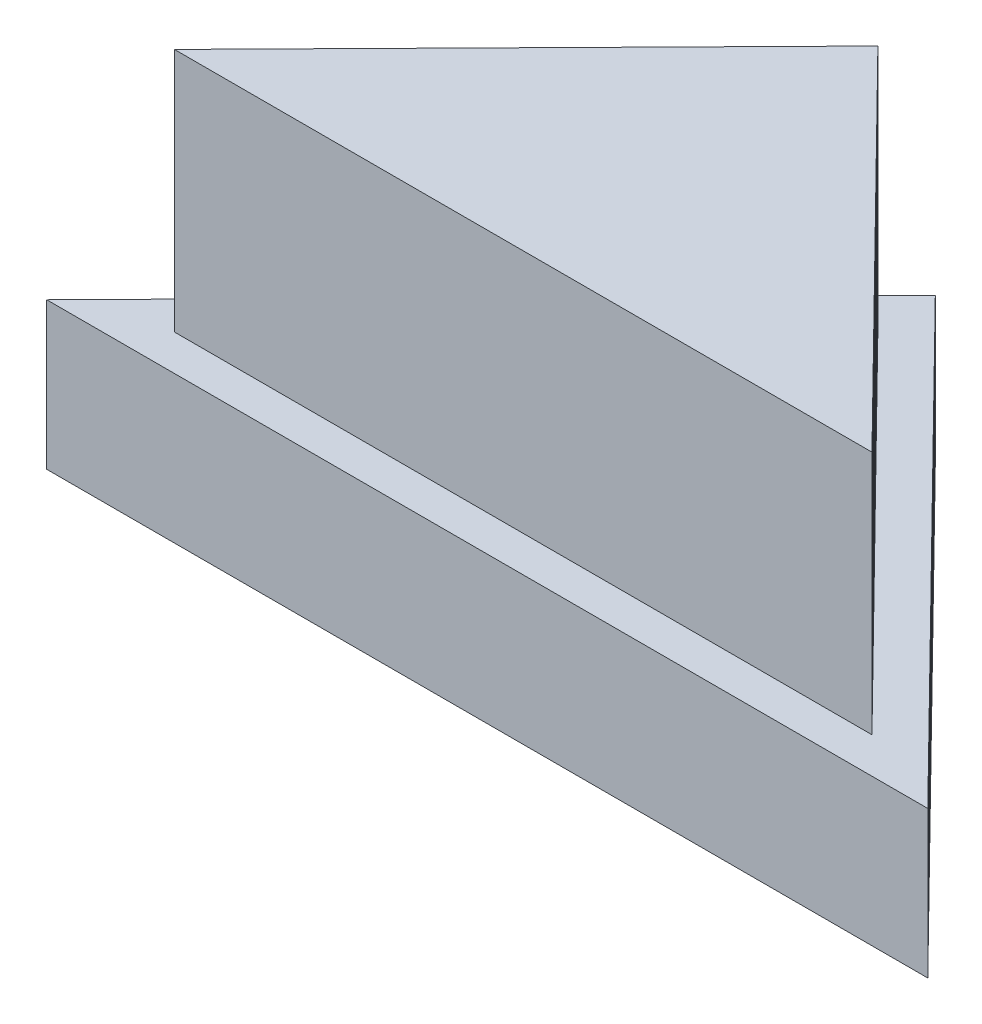
ISO-10303-21;
HEADER;
FILE_DESCRIPTION(('STEP AP214'),'2;1');
FILE_NAME('part.step','',(''),(''),'','','');
FILE_SCHEMA(('AUTOMOTIVE_DESIGN { 1 0 10303 214 1 1 1 1 }'));
ENDSEC;
DATA;
#1=APPLICATION_CONTEXT('core data for automotive mechanical design processes');
#2=APPLICATION_PROTOCOL_DEFINITION('international standard','automotive_design',2000,#1);
#3=PRODUCT_CONTEXT('',#1,'mechanical');
#4=PRODUCT('Part','Part','',(#3));
#5=PRODUCT_RELATED_PRODUCT_CATEGORY('part','',(#4));
#6=PRODUCT_DEFINITION_FORMATION('','',#4);
#7=PRODUCT_DEFINITION_CONTEXT('part definition',#1,'design');
#8=PRODUCT_DEFINITION('design','',#6,#7);
#9=PRODUCT_DEFINITION_SHAPE('','',#8);
#10=(LENGTH_UNIT() NAMED_UNIT(*) SI_UNIT(.MILLI.,.METRE.));
#11=(NAMED_UNIT(*) PLANE_ANGLE_UNIT() SI_UNIT($,.RADIAN.));
#12=(NAMED_UNIT(*) SI_UNIT($,.STERADIAN.) SOLID_ANGLE_UNIT());
#13=UNCERTAINTY_MEASURE_WITH_UNIT(LENGTH_MEASURE(1.E-05),#10,'distance_accuracy_value','');
#14=(GEOMETRIC_REPRESENTATION_CONTEXT(3) GLOBAL_UNCERTAINTY_ASSIGNED_CONTEXT((#13)) GLOBAL_UNIT_ASSIGNED_CONTEXT((#10,
#11,#12)) REPRESENTATION_CONTEXT('',''));
#15=CARTESIAN_POINT('',(0.,0.,0.));
#16=DIRECTION('',(0.,0.,1.));
#17=DIRECTION('',(1.,0.,0.));
#18=AXIS2_PLACEMENT_3D('',#15,#16,#17);
#19=CARTESIAN_POINT('',(0.,3.,0.));
#20=DIRECTION('',(0.,-1.,0.));
#21=DIRECTION('',(0.,0.,-1.));
#22=AXIS2_PLACEMENT_3D('',#19,#20,#21);
#23=PLANE('',#22);
#24=DIRECTION('',(-0.70110636736576,0.,0.713056702962105));
#25=VECTOR('',#24,1.);
#26=CARTESIAN_POINT('',(-0.0167470017223667,3.,-0.756293591484106));
#27=LINE('',#26,#25);
#28=CARTESIAN_POINT('',(-0.0167470017223667,3.,-0.756293591484106));
#29=VERTEX_POINT('',#28);
#30=CARTESIAN_POINT('',(-9.01674700172237,3.,8.39711112051589));
#31=VERTEX_POINT('',#30);
#32=EDGE_CURVE('E125',#29,#31,#27,.T.);
#33=ORIENTED_EDGE('',*,*,#32,.T.);
#34=DIRECTION('',(1.,0.,0.));
#35=VECTOR('',#34,1.);
#36=CARTESIAN_POINT('',(8.98325299827764,3.,8.39711112051589));
#37=LINE('',#36,#35);
#38=CARTESIAN_POINT('',(8.98325299827764,3.,8.39711112051589));
#39=VERTEX_POINT('',#38);
#40=EDGE_CURVE('E129',#31,#39,#37,.T.);
#41=ORIENTED_EDGE('',*,*,#40,.T.);
#42=DIRECTION('',(-0.70110636736576,0.,-0.713056702962105));
#43=VECTOR('',#42,1.);
#44=CARTESIAN_POINT('',(8.98325299827764,3.,8.39711112051589));
#45=LINE('',#44,#43);
#46=EDGE_CURVE('E133',#39,#29,#45,.T.);
#47=ORIENTED_EDGE('',*,*,#46,.T.);
#48=EDGE_LOOP('',(#33,#41,#47));
#49=FACE_BOUND('',#48,.T.);
#50=DIRECTION('',(-0.701111712421095,0.,0.713051447446788));
#51=VECTOR('',#50,1.);
#52=CARTESIAN_POINT('',(-7.1410848865332,3.,7.66338087653282));
#53=LINE('',#52,#51);
#54=CARTESIAN_POINT('',(-0.0159780494453974,3.,0.416935476477905));
#55=VERTEX_POINT('',#54);
#56=CARTESIAN_POINT('',(-7.1410848865332,3.,7.66338087653282));
#57=VERTEX_POINT('',#56);
#58=EDGE_CURVE('E55',#55,#57,#53,.T.);
#59=ORIENTED_EDGE('',*,*,#58,.F.);
#60=DIRECTION('',(-0.701106367215476,0.,-0.713056703109871));
#61=VECTOR('',#60,1.);
#62=CARTESIAN_POINT('',(7.10902195055455,3.,7.66338087653282));
#63=LINE('',#62,#61);
#64=CARTESIAN_POINT('',(7.10902195055455,3.,7.66338087653282));
#65=VERTEX_POINT('',#64);
#66=EDGE_CURVE('E110',#65,#55,#63,.T.);
#67=ORIENTED_EDGE('',*,*,#66,.F.);
#68=DIRECTION('',(1.,0.,0.));
#69=VECTOR('',#68,1.);
#70=CARTESIAN_POINT('',(7.10902195055455,3.,7.66338087653282));
#71=LINE('',#70,#69);
#72=EDGE_CURVE('E59',#57,#65,#71,.T.);
#73=ORIENTED_EDGE('',*,*,#72,.F.);
#74=EDGE_LOOP('',(#59,#67,#73));
#75=FACE_BOUND('',#74,.T.);
#76=ADVANCED_FACE('F39',(#49,#75),#23,.F.);
#77=CARTESIAN_POINT('',(-0.0167470017223667,3.,-0.756293591484106));
#78=DIRECTION('',(0.713056702962105,0.,0.70110636736576));
#79=DIRECTION('',(0.70110636736576,0.,-0.713056702962105));
#80=AXIS2_PLACEMENT_3D('',#77,#78,#79);
#81=PLANE('',#80);
#82=DIRECTION('',(-0.70110636736576,0.,0.713056702962105));
#83=VECTOR('',#82,1.);
#84=CARTESIAN_POINT('',(-0.0167470017223667,0.,-0.756293591484106));
#85=LINE('',#84,#83);
#86=CARTESIAN_POINT('',(-0.0167470017223667,0.,-0.756293591484106));
#87=VERTEX_POINT('',#86);
#88=CARTESIAN_POINT('',(-9.01674700172237,0.,8.39711112051589));
#89=VERTEX_POINT('',#88);
#90=EDGE_CURVE('E114',#87,#89,#85,.T.);
#91=ORIENTED_EDGE('',*,*,#90,.T.);
#92=DIRECTION('',(0.,-1.,0.));
#93=VECTOR('',#92,1.);
#94=CARTESIAN_POINT('',(-9.01674700172237,3.,8.39711112051589));
#95=LINE('',#94,#93);
#96=EDGE_CURVE('E11',#31,#89,#95,.T.);
#97=ORIENTED_EDGE('',*,*,#96,.F.);
#98=ORIENTED_EDGE('',*,*,#32,.F.);
#99=DIRECTION('',(0.,-1.,0.));
#100=VECTOR('',#99,1.);
#101=CARTESIAN_POINT('',(-0.0167470017223667,3.,-0.756293591484106));
#102=LINE('',#101,#100);
#103=EDGE_CURVE('E135',#29,#87,#102,.T.);
#104=ORIENTED_EDGE('',*,*,#103,.T.);
#105=EDGE_LOOP('',(#91,#97,#98,#104));
#106=FACE_BOUND('',#105,.T.);
#107=ADVANCED_FACE('F41',(#106),#81,.F.);
#108=CARTESIAN_POINT('',(8.98325299827764,3.,8.39711112051589));
#109=DIRECTION('',(0.,0.,-1.));
#110=DIRECTION('',(-1.,0.,0.));
#111=AXIS2_PLACEMENT_3D('',#108,#109,#110);
#112=PLANE('',#111);
#113=DIRECTION('',(1.,0.,0.));
#114=VECTOR('',#113,1.);
#115=CARTESIAN_POINT('',(8.98325299827764,0.,8.39711112051589));
#116=LINE('',#115,#114);
#117=CARTESIAN_POINT('',(8.98325299827764,0.,8.39711112051589));
#118=VERTEX_POINT('',#117);
#119=EDGE_CURVE('E119',#89,#118,#116,.T.);
#120=ORIENTED_EDGE('',*,*,#119,.T.);
#121=DIRECTION('',(0.,-1.,0.));
#122=VECTOR('',#121,1.);
#123=CARTESIAN_POINT('',(8.98325299827764,3.,8.39711112051589));
#124=LINE('',#123,#122);
#125=EDGE_CURVE('E48',#39,#118,#124,.T.);
#126=ORIENTED_EDGE('',*,*,#125,.F.);
#127=ORIENTED_EDGE('',*,*,#40,.F.);
#128=ORIENTED_EDGE('',*,*,#96,.T.);
#129=EDGE_LOOP('',(#120,#126,#127,#128));
#130=FACE_BOUND('',#129,.T.);
#131=ADVANCED_FACE('F159',(#130),#112,.F.);
#132=CARTESIAN_POINT('',(8.98325299827764,3.,8.39711112051589));
#133=DIRECTION('',(-0.713056702962105,0.,0.70110636736576));
#134=DIRECTION('',(0.70110636736576,0.,0.713056702962105));
#135=AXIS2_PLACEMENT_3D('',#132,#133,#134);
#136=PLANE('',#135);
#137=DIRECTION('',(-0.70110636736576,0.,-0.713056702962105));
#138=VECTOR('',#137,1.);
#139=CARTESIAN_POINT('',(8.98325299827764,0.,8.39711112051589));
#140=LINE('',#139,#138);
#141=EDGE_CURVE('E130',#118,#87,#140,.T.);
#142=ORIENTED_EDGE('',*,*,#141,.T.);
#143=ORIENTED_EDGE('',*,*,#103,.F.);
#144=ORIENTED_EDGE('',*,*,#46,.F.);
#145=ORIENTED_EDGE('',*,*,#125,.T.);
#146=EDGE_LOOP('',(#142,#143,#144,#145));
#147=FACE_BOUND('',#146,.T.);
#148=ADVANCED_FACE('F149',(#147),#136,.F.);
#149=CARTESIAN_POINT('',(0.,0.,0.));
#150=DIRECTION('',(0.,-1.,0.));
#151=DIRECTION('',(0.,0.,-1.));
#152=AXIS2_PLACEMENT_3D('',#149,#150,#151);
#153=PLANE('',#152);
#154=CARTESIAN_POINT('',(-0.0167470017223598,0.,5.34597621651589));
#155=DIRECTION('',(0.,-1.,0.));
#156=DIRECTION('',(0.,0.,-1.));
#157=AXIS2_PLACEMENT_3D('',#154,#155,#156);
#158=CIRCLE('',#157,1.8);
#159=CARTESIAN_POINT('',(-0.0167470017223598,0.,3.54597621651589));
#160=VERTEX_POINT('',#159);
#161=EDGE_CURVE('E180',#160,#160,#158,.T.);
#162=ORIENTED_EDGE('',*,*,#161,.F.);
#163=EDGE_LOOP('',(#162));
#164=FACE_BOUND('',#163,.T.);
#165=ORIENTED_EDGE('',*,*,#90,.F.);
#166=ORIENTED_EDGE('',*,*,#141,.F.);
#167=ORIENTED_EDGE('',*,*,#119,.F.);
#168=EDGE_LOOP('',(#165,#166,#167));
#169=FACE_BOUND('',#168,.T.);
#170=ADVANCED_FACE('F154',(#164,#169),#153,.T.);
#171=CARTESIAN_POINT('',(-7.1410848865332,8.,7.66338087653282));
#172=DIRECTION('',(0.713051447446788,0.,0.701111712421095));
#173=DIRECTION('',(0.701111712421095,0.,-0.713051447446788));
#174=AXIS2_PLACEMENT_3D('',#171,#172,#173);
#175=PLANE('',#174);
#176=ORIENTED_EDGE('',*,*,#58,.T.);
#177=DIRECTION('',(0.,-1.,0.));
#178=VECTOR('',#177,1.);
#179=CARTESIAN_POINT('',(-7.1410848865332,8.,7.66338087653282));
#180=LINE('',#179,#178);
#181=CARTESIAN_POINT('',(-7.1410848865332,8.,7.66338087653282));
#182=VERTEX_POINT('',#181);
#183=EDGE_CURVE('E95',#182,#57,#180,.T.);
#184=ORIENTED_EDGE('',*,*,#183,.F.);
#185=DIRECTION('',(-0.701111712421095,0.,0.713051447446788));
#186=VECTOR('',#185,1.);
#187=CARTESIAN_POINT('',(-7.1410848865332,8.,7.66338087653282));
#188=LINE('',#187,#186);
#189=CARTESIAN_POINT('',(-0.0159780494453974,8.,0.416935476477905));
#190=VERTEX_POINT('',#189);
#191=EDGE_CURVE('E102',#190,#182,#188,.T.);
#192=ORIENTED_EDGE('',*,*,#191,.F.);
#193=DIRECTION('',(0.,-1.,0.));
#194=VECTOR('',#193,1.);
#195=CARTESIAN_POINT('',(-0.0159780494453974,8.,0.416935476477905));
#196=LINE('',#195,#194);
#197=EDGE_CURVE('E121',#190,#55,#196,.T.);
#198=ORIENTED_EDGE('',*,*,#197,.T.);
#199=EDGE_LOOP('',(#176,#184,#192,#198));
#200=FACE_BOUND('',#199,.T.);
#201=ADVANCED_FACE('F112',(#200),#175,.F.);
#202=CARTESIAN_POINT('',(7.10902195055455,8.,7.66338087653282));
#203=DIRECTION('',(0.,0.,-1.));
#204=DIRECTION('',(-1.,0.,0.));
#205=AXIS2_PLACEMENT_3D('',#202,#203,#204);
#206=PLANE('',#205);
#207=ORIENTED_EDGE('',*,*,#72,.T.);
#208=DIRECTION('',(0.,-1.,0.));
#209=VECTOR('',#208,1.);
#210=CARTESIAN_POINT('',(7.10902195055455,8.,7.66338087653282));
#211=LINE('',#210,#209);
#212=CARTESIAN_POINT('',(7.10902195055455,8.,7.66338087653282));
#213=VERTEX_POINT('',#212);
#214=EDGE_CURVE('E97',#213,#65,#211,.T.);
#215=ORIENTED_EDGE('',*,*,#214,.F.);
#216=DIRECTION('',(1.,0.,0.));
#217=VECTOR('',#216,1.);
#218=CARTESIAN_POINT('',(7.10902195055455,8.,7.66338087653282));
#219=LINE('',#218,#217);
#220=EDGE_CURVE('E91',#182,#213,#219,.T.);
#221=ORIENTED_EDGE('',*,*,#220,.F.);
#222=ORIENTED_EDGE('',*,*,#183,.T.);
#223=EDGE_LOOP('',(#207,#215,#221,#222));
#224=FACE_BOUND('',#223,.T.);
#225=ADVANCED_FACE('F93',(#224),#206,.F.);
#226=CARTESIAN_POINT('',(7.10902195055455,8.,7.66338087653282));
#227=DIRECTION('',(-0.713056703109871,0.,0.701106367215476));
#228=DIRECTION('',(0.701106367215476,0.,0.713056703109871));
#229=AXIS2_PLACEMENT_3D('',#226,#227,#228);
#230=PLANE('',#229);
#231=ORIENTED_EDGE('',*,*,#66,.T.);
#232=ORIENTED_EDGE('',*,*,#197,.F.);
#233=DIRECTION('',(-0.701106367215476,0.,-0.713056703109871));
#234=VECTOR('',#233,1.);
#235=CARTESIAN_POINT('',(7.10902195055455,8.,7.66338087653282));
#236=LINE('',#235,#234);
#237=EDGE_CURVE('E101',#213,#190,#236,.T.);
#238=ORIENTED_EDGE('',*,*,#237,.F.);
#239=ORIENTED_EDGE('',*,*,#214,.T.);
#240=EDGE_LOOP('',(#231,#232,#238,#239));
#241=FACE_BOUND('',#240,.T.);
#242=ADVANCED_FACE('F198',(#241),#230,.F.);
#243=CARTESIAN_POINT('',(0.,8.,0.));
#244=DIRECTION('',(0.,1.,0.));
#245=DIRECTION('',(0.,0.,1.));
#246=AXIS2_PLACEMENT_3D('',#243,#244,#245);
#247=PLANE('',#246);
#248=ORIENTED_EDGE('',*,*,#191,.T.);
#249=ORIENTED_EDGE('',*,*,#220,.T.);
#250=ORIENTED_EDGE('',*,*,#237,.T.);
#251=EDGE_LOOP('',(#248,#249,#250));
#252=FACE_BOUND('',#251,.T.);
#253=ADVANCED_FACE('F105',(#252),#247,.T.);
#254=CARTESIAN_POINT('',(-0.0167470017223598,1.,5.34597621651589));
#255=DIRECTION('',(0.,-1.,0.));
#256=DIRECTION('',(0.,0.,-1.));
#257=AXIS2_PLACEMENT_3D('',#254,#255,#256);
#258=CYLINDRICAL_SURFACE('',#257,1.8);
#259=CARTESIAN_POINT('',(-0.0167470017223598,1.,5.34597621651589));
#260=DIRECTION('',(0.,-1.,0.));
#261=DIRECTION('',(0.,0.,-1.));
#262=AXIS2_PLACEMENT_3D('',#259,#260,#261);
#263=CIRCLE('',#262,1.8);
#264=CARTESIAN_POINT('',(-0.0167470017223598,1.,3.54597621651589));
#265=VERTEX_POINT('',#264);
#266=EDGE_CURVE('E183',#265,#265,#263,.T.);
#267=ORIENTED_EDGE('',*,*,#266,.F.);
#268=EDGE_LOOP('',(#267));
#269=FACE_BOUND('',#268,.T.);
#270=ORIENTED_EDGE('',*,*,#161,.T.);
#271=EDGE_LOOP('',(#270));
#272=FACE_BOUND('',#271,.T.);
#273=ADVANCED_FACE('F205',(#269,#272),#258,.F.);
#274=CARTESIAN_POINT('',(-0.0167470017223598,1.,5.34597621651589));
#275=DIRECTION('',(0.,-1.,0.));
#276=DIRECTION('',(0.,0.,-1.));
#277=AXIS2_PLACEMENT_3D('',#274,#275,#276);
#278=PLANE('',#277);
#279=ORIENTED_EDGE('',*,*,#266,.T.);
#280=EDGE_LOOP('',(#279));
#281=FACE_BOUND('',#280,.T.);
#282=ADVANCED_FACE('F210',(#281),#278,.T.);
#283=CLOSED_SHELL('',(#76,#107,#131,#148,#170,#201,#225,#242,#253,#273,#282));
#284=MANIFOLD_SOLID_BREP('B2',#283);
#285=ADVANCED_BREP_SHAPE_REPRESENTATION('',(#18,#284),#14);
#286=SHAPE_DEFINITION_REPRESENTATION(#9,#285);
ENDSEC;
END-ISO-10303-21;
